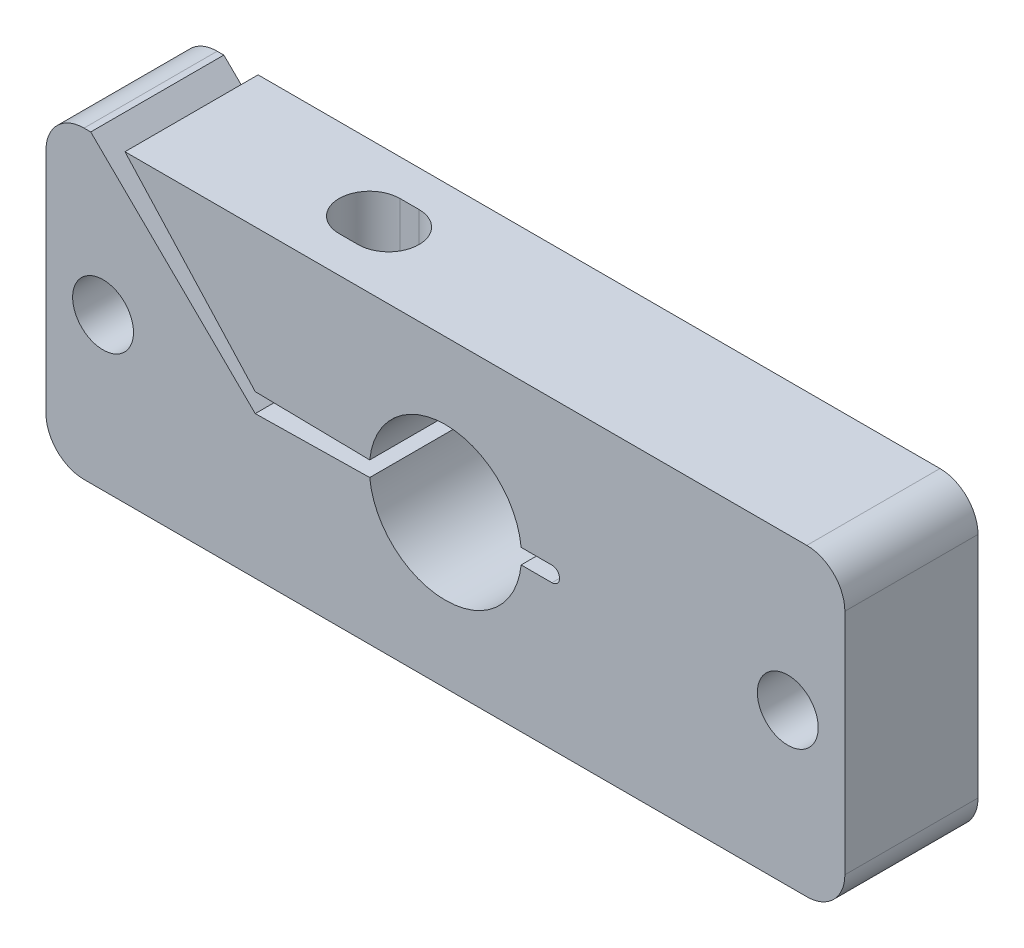
ISO-10303-21;
HEADER;
FILE_DESCRIPTION(('STEP AP214'),'2;1');
FILE_NAME('part.step','',(''),(''),'','','');
FILE_SCHEMA(('AUTOMOTIVE_DESIGN { 1 0 10303 214 1 1 1 1 }'));
ENDSEC;
DATA;
#1=APPLICATION_CONTEXT('core data for automotive mechanical design processes');
#2=APPLICATION_PROTOCOL_DEFINITION('international standard','automotive_design',2000,#1);
#3=PRODUCT_CONTEXT('',#1,'mechanical');
#4=PRODUCT('Part','Part','',(#3));
#5=PRODUCT_RELATED_PRODUCT_CATEGORY('part','',(#4));
#6=PRODUCT_DEFINITION_FORMATION('','',#4);
#7=PRODUCT_DEFINITION_CONTEXT('part definition',#1,'design');
#8=PRODUCT_DEFINITION('design','',#6,#7);
#9=PRODUCT_DEFINITION_SHAPE('','',#8);
#10=(LENGTH_UNIT() NAMED_UNIT(*) SI_UNIT(.MILLI.,.METRE.));
#11=(NAMED_UNIT(*) PLANE_ANGLE_UNIT() SI_UNIT($,.RADIAN.));
#12=(NAMED_UNIT(*) SI_UNIT($,.STERADIAN.) SOLID_ANGLE_UNIT());
#13=UNCERTAINTY_MEASURE_WITH_UNIT(LENGTH_MEASURE(1.E-05),#10,'distance_accuracy_value','');
#14=(GEOMETRIC_REPRESENTATION_CONTEXT(3) GLOBAL_UNCERTAINTY_ASSIGNED_CONTEXT((#13)) GLOBAL_UNIT_ASSIGNED_CONTEXT((#10,
#11,#12)) REPRESENTATION_CONTEXT('',''));
#15=CARTESIAN_POINT('',(0.,0.,0.));
#16=DIRECTION('',(0.,0.,1.));
#17=DIRECTION('',(1.,0.,0.));
#18=AXIS2_PLACEMENT_3D('',#15,#16,#17);
#19=CARTESIAN_POINT('',(5.6,0.,-3.5));
#20=DIRECTION('',(0.,0.,1.));
#21=DIRECTION('',(1.,0.,0.));
#22=AXIS2_PLACEMENT_3D('',#19,#20,#21);
#23=CYLINDRICAL_SURFACE('',#22,0.4);
#24=DIRECTION('',(0.,0.,-1.));
#25=VECTOR('',#24,1.);
#26=CARTESIAN_POINT('',(5.6,0.4,-3.5));
#27=LINE('',#26,#25);
#28=CARTESIAN_POINT('',(5.6,0.4,-3.5));
#29=VERTEX_POINT('',#28);
#30=CARTESIAN_POINT('',(5.6,0.4,3.5));
#31=VERTEX_POINT('',#30);
#32=EDGE_CURVE('E388',#29,#31,#27,.F.);
#33=ORIENTED_EDGE('',*,*,#32,.F.);
#34=CARTESIAN_POINT('',(5.6,0.,-3.5));
#35=DIRECTION('',(0.,0.,1.));
#36=DIRECTION('',(1.,0.,0.));
#37=AXIS2_PLACEMENT_3D('',#34,#35,#36);
#38=CIRCLE('',#37,0.4);
#39=CARTESIAN_POINT('',(5.6,-0.4,-3.5));
#40=VERTEX_POINT('',#39);
#41=EDGE_CURVE('E54',#29,#40,#38,.F.);
#42=ORIENTED_EDGE('',*,*,#41,.T.);
#43=DIRECTION('',(0.,0.,-1.));
#44=VECTOR('',#43,1.);
#45=CARTESIAN_POINT('',(5.6,-0.4,-3.5));
#46=LINE('',#45,#44);
#47=CARTESIAN_POINT('',(5.6,-0.4,3.5));
#48=VERTEX_POINT('',#47);
#49=EDGE_CURVE('E389',#48,#40,#46,.T.);
#50=ORIENTED_EDGE('',*,*,#49,.F.);
#51=CARTESIAN_POINT('',(5.6,0.,3.5));
#52=DIRECTION('',(0.,0.,1.));
#53=DIRECTION('',(1.,0.,0.));
#54=AXIS2_PLACEMENT_3D('',#51,#52,#53);
#55=CIRCLE('',#54,0.4);
#56=EDGE_CURVE('E11',#48,#31,#55,.T.);
#57=ORIENTED_EDGE('',*,*,#56,.T.);
#58=EDGE_LOOP('',(#33,#42,#50,#57));
#59=FACE_BOUND('',#58,.T.);
#60=ADVANCED_FACE('F50',(#59),#23,.F.);
#61=CARTESIAN_POINT('',(-6.98997487421324,8.001,0.));
#62=DIRECTION('',(0.,-1.,0.));
#63=DIRECTION('',(0.,0.,-1.));
#64=AXIS2_PLACEMENT_3D('',#61,#62,#63);
#65=CYLINDRICAL_SURFACE('',#64,1.6);
#66=CARTESIAN_POINT('',(-6.98997487421324,-0.450000000000001,0.));
#67=DIRECTION('',(-0.0166088657318921,0.99986206327628,0.));
#68=DIRECTION('',(-0.99986206327628,-0.0166088657318921,0.));
#69=AXIS2_PLACEMENT_3D('',#66,#67,#68);
#70=ELLIPSE('',#69,1.60022072920462,1.6);
#71=CARTESIAN_POINT('',(-8.58997487421324,-0.476577851232751,0.));
#72=VERTEX_POINT('',#71);
#73=EDGE_CURVE('E245',#72,#72,#70,.F.);
#74=ORIENTED_EDGE('',*,*,#73,.F.);
#75=EDGE_LOOP('',(#74));
#76=FACE_BOUND('',#75,.T.);
#77=CARTESIAN_POINT('',(-6.98997487421324,-1.99999999999999,0.));
#78=DIRECTION('',(0.,-1.,0.));
#79=DIRECTION('',(0.,0.,-1.));
#80=AXIS2_PLACEMENT_3D('',#77,#78,#79);
#81=CIRCLE('',#80,1.6);
#82=CARTESIAN_POINT('',(-6.98997487421324,-1.99999999999999,-1.6));
#83=VERTEX_POINT('',#82);
#84=EDGE_CURVE('E214',#83,#83,#81,.T.);
#85=ORIENTED_EDGE('',*,*,#84,.T.);
#86=EDGE_LOOP('',(#85));
#87=FACE_BOUND('',#86,.T.);
#88=ADVANCED_FACE('F470',(#76,#87),#65,.F.);
#89=CARTESIAN_POINT('',(0.,0.,-3.5));
#90=DIRECTION('',(0.,0.,1.));
#91=DIRECTION('',(1.,0.,0.));
#92=AXIS2_PLACEMENT_3D('',#89,#90,#91);
#93=CYLINDRICAL_SURFACE('',#92,4.);
#94=DIRECTION('',(0.,0.,1.));
#95=VECTOR('',#94,1.);
#96=CARTESIAN_POINT('',(3.97994974842648,0.4,-3.5));
#97=LINE('',#96,#95);
#98=CARTESIAN_POINT('',(3.97994974842648,0.4,-3.5));
#99=VERTEX_POINT('',#98);
#100=CARTESIAN_POINT('',(3.97994974842648,0.4,3.5));
#101=VERTEX_POINT('',#100);
#102=EDGE_CURVE('E334',#99,#101,#97,.T.);
#103=ORIENTED_EDGE('',*,*,#102,.T.);
#104=CARTESIAN_POINT('',(0.,0.,3.5));
#105=DIRECTION('',(0.,0.,-1.));
#106=DIRECTION('',(1.,0.,0.));
#107=AXIS2_PLACEMENT_3D('',#104,#105,#106);
#108=CIRCLE('',#107,4.);
#109=CARTESIAN_POINT('',(-3.97994974842648,0.4,3.5));
#110=VERTEX_POINT('',#109);
#111=EDGE_CURVE('E254',#110,#101,#108,.T.);
#112=ORIENTED_EDGE('',*,*,#111,.F.);
#113=DIRECTION('',(0.,0.,1.));
#114=VECTOR('',#113,1.);
#115=CARTESIAN_POINT('',(-3.97994974842648,0.4,-3.5));
#116=LINE('',#115,#114);
#117=CARTESIAN_POINT('',(-3.97994974842648,0.4,-3.5));
#118=VERTEX_POINT('',#117);
#119=EDGE_CURVE('E335',#118,#110,#116,.T.);
#120=ORIENTED_EDGE('',*,*,#119,.F.);
#121=CARTESIAN_POINT('',(0.,0.,-3.5));
#122=DIRECTION('',(0.,0.,-1.));
#123=DIRECTION('',(1.,0.,0.));
#124=AXIS2_PLACEMENT_3D('',#121,#122,#123);
#125=CIRCLE('',#124,4.);
#126=EDGE_CURVE('E294',#118,#99,#125,.T.);
#127=ORIENTED_EDGE('',*,*,#126,.T.);
#128=EDGE_LOOP('',(#103,#112,#120,#127));
#129=FACE_BOUND('',#128,.T.);
#130=ADVANCED_FACE('F464',(#129),#93,.F.);
#131=CARTESIAN_POINT('',(-10.,0.5,-3.5));
#132=DIRECTION('',(-0.0166088657318921,-0.99986206327628,0.));
#133=DIRECTION('',(0.99986206327628,-0.0166088657318921,0.));
#134=AXIS2_PLACEMENT_3D('',#131,#132,#133);
#135=PLANE('',#134);
#136=CARTESIAN_POINT('',(-7.48997487421324,0.458305578510235,0.));
#137=DIRECTION('',(-0.0166088657318921,-0.99986206327628,0.));
#138=DIRECTION('',(-0.99986206327628,0.0166088657318921,0.));
#139=AXIS2_PLACEMENT_3D('',#136,#137,#138);
#140=ELLIPSE('',#139,1.60022072920462,1.6);
#141=CARTESIAN_POINT('',(-7.48997487421324,0.458305578510235,-1.6));
#142=VERTEX_POINT('',#141);
#143=CARTESIAN_POINT('',(-7.48997487421324,0.458305578510235,1.6));
#144=VERTEX_POINT('',#143);
#145=EDGE_CURVE('E197',#142,#144,#140,.F.);
#146=ORIENTED_EDGE('',*,*,#145,.T.);
#147=DIRECTION('',(0.99986206327628,-0.0166088657318921,0.));
#148=VECTOR('',#147,1.);
#149=CARTESIAN_POINT('',(-7.34949478371137,0.455972041668659,1.6));
#150=LINE('',#149,#148);
#151=CARTESIAN_POINT('',(-6.48997487421324,0.441694421489766,1.6));
#152=VERTEX_POINT('',#151);
#153=EDGE_CURVE('E223',#144,#152,#150,.T.);
#154=ORIENTED_EDGE('',*,*,#153,.T.);
#155=CARTESIAN_POINT('',(-6.48997487421324,0.441694421489766,0.));
#156=DIRECTION('',(-0.0166088657318921,-0.99986206327628,0.));
#157=DIRECTION('',(-0.99986206327628,0.0166088657318921,0.));
#158=AXIS2_PLACEMENT_3D('',#155,#156,#157);
#159=ELLIPSE('',#158,1.60022072920462,1.6);
#160=CARTESIAN_POINT('',(-6.48997487421324,0.441694421489766,-1.6));
#161=VERTEX_POINT('',#160);
#162=EDGE_CURVE('E205',#152,#161,#159,.F.);
#163=ORIENTED_EDGE('',*,*,#162,.T.);
#164=DIRECTION('',(-0.99986206327628,0.0166088657318921,0.));
#165=VECTOR('',#164,1.);
#166=CARTESIAN_POINT('',(-7.34949478371137,0.455972041668659,-1.6));
#167=LINE('',#166,#165);
#168=EDGE_CURVE('E201',#161,#142,#167,.T.);
#169=ORIENTED_EDGE('',*,*,#168,.T.);
#170=EDGE_LOOP('',(#146,#154,#163,#169));
#171=FACE_BOUND('',#170,.T.);
#172=ORIENTED_EDGE('',*,*,#119,.T.);
#173=DIRECTION('',(0.99986206327628,-0.0166088657318921,0.));
#174=VECTOR('',#173,1.);
#175=CARTESIAN_POINT('',(-10.,0.5,3.5));
#176=LINE('',#175,#174);
#177=CARTESIAN_POINT('',(-10.,0.5,3.5));
#178=VERTEX_POINT('',#177);
#179=EDGE_CURVE('E287',#178,#110,#176,.T.);
#180=ORIENTED_EDGE('',*,*,#179,.F.);
#181=DIRECTION('',(0.,0.,1.));
#182=VECTOR('',#181,1.);
#183=CARTESIAN_POINT('',(-10.,0.5,-3.5));
#184=LINE('',#183,#182);
#185=CARTESIAN_POINT('',(-10.,0.5,-3.5));
#186=VERTEX_POINT('',#185);
#187=EDGE_CURVE('E337',#186,#178,#184,.T.);
#188=ORIENTED_EDGE('',*,*,#187,.F.);
#189=DIRECTION('',(0.99986206327628,-0.0166088657318921,0.));
#190=VECTOR('',#189,1.);
#191=CARTESIAN_POINT('',(-10.,0.5,-3.5));
#192=LINE('',#191,#190);
#193=EDGE_CURVE('E328',#186,#118,#192,.T.);
#194=ORIENTED_EDGE('',*,*,#193,.T.);
#195=EDGE_LOOP('',(#172,#180,#188,#194));
#196=FACE_BOUND('',#195,.T.);
#197=ADVANCED_FACE('F460',(#171,#196),#135,.T.);
#198=CARTESIAN_POINT('',(-10.,0.5,-3.5));
#199=DIRECTION('',(-0.73845534062588,-0.674302387583728,0.));
#200=DIRECTION('',(0.674302387583728,-0.73845534062588,0.));
#201=AXIS2_PLACEMENT_3D('',#198,#199,#200);
#202=PLANE('',#201);
#203=ORIENTED_EDGE('',*,*,#187,.T.);
#204=DIRECTION('',(0.674302387583728,-0.73845534062588,0.));
#205=VECTOR('',#204,1.);
#206=CARTESIAN_POINT('',(-10.,0.5,3.5));
#207=LINE('',#206,#205);
#208=CARTESIAN_POINT('',(-16.8484411021954,8.,3.5));
#209=VERTEX_POINT('',#208);
#210=EDGE_CURVE('E285',#209,#178,#207,.T.);
#211=ORIENTED_EDGE('',*,*,#210,.F.);
#212=DIRECTION('',(0.,0.,1.));
#213=VECTOR('',#212,1.);
#214=CARTESIAN_POINT('',(-16.8484411021954,8.,-3.5));
#215=LINE('',#214,#213);
#216=CARTESIAN_POINT('',(-16.8484411021954,8.,-3.5));
#217=VERTEX_POINT('',#216);
#218=EDGE_CURVE('E336',#217,#209,#215,.T.);
#219=ORIENTED_EDGE('',*,*,#218,.F.);
#220=DIRECTION('',(0.674302387583728,-0.73845534062588,0.));
#221=VECTOR('',#220,1.);
#222=CARTESIAN_POINT('',(-10.,0.5,-3.5));
#223=LINE('',#222,#221);
#224=EDGE_CURVE('E329',#217,#186,#223,.T.);
#225=ORIENTED_EDGE('',*,*,#224,.T.);
#226=EDGE_LOOP('',(#203,#211,#219,#225));
#227=FACE_BOUND('',#226,.T.);
#228=ADVANCED_FACE('F454',(#227),#202,.T.);
#229=CARTESIAN_POINT('',(-16.8484411021954,8.,-3.5));
#230=DIRECTION('',(0.,1.,0.));
#231=DIRECTION('',(-1.,0.,0.));
#232=AXIS2_PLACEMENT_3D('',#229,#230,#231);
#233=PLANE('',#232);
#234=CARTESIAN_POINT('',(-7.48997487421324,8.,0.));
#235=DIRECTION('',(0.,1.,0.));
#236=DIRECTION('',(0.,0.,1.));
#237=AXIS2_PLACEMENT_3D('',#234,#235,#236);
#238=CIRCLE('',#237,1.6);
#239=CARTESIAN_POINT('',(-7.48997487421324,8.,-1.6));
#240=VERTEX_POINT('',#239);
#241=CARTESIAN_POINT('',(-7.48997487421324,8.,1.6));
#242=VERTEX_POINT('',#241);
#243=EDGE_CURVE('E196',#240,#242,#238,.T.);
#244=ORIENTED_EDGE('',*,*,#243,.F.);
#245=DIRECTION('',(-1.,0.,0.));
#246=VECTOR('',#245,1.);
#247=CARTESIAN_POINT('',(-7.48997487421324,8.,-1.6));
#248=LINE('',#247,#246);
#249=CARTESIAN_POINT('',(-6.48997487421324,8.,-1.6));
#250=VERTEX_POINT('',#249);
#251=EDGE_CURVE('E210',#250,#240,#248,.T.);
#252=ORIENTED_EDGE('',*,*,#251,.F.);
#253=CARTESIAN_POINT('',(-6.48997487421324,8.,0.));
#254=DIRECTION('',(0.,1.,0.));
#255=DIRECTION('',(0.,0.,1.));
#256=AXIS2_PLACEMENT_3D('',#253,#254,#255);
#257=CIRCLE('',#256,1.6);
#258=CARTESIAN_POINT('',(-6.48997487421324,8.,1.6));
#259=VERTEX_POINT('',#258);
#260=EDGE_CURVE('E212',#259,#250,#257,.T.);
#261=ORIENTED_EDGE('',*,*,#260,.F.);
#262=DIRECTION('',(1.,0.,0.));
#263=VECTOR('',#262,1.);
#264=CARTESIAN_POINT('',(-7.48997487421324,8.,1.6));
#265=LINE('',#264,#263);
#266=EDGE_CURVE('E222',#242,#259,#265,.T.);
#267=ORIENTED_EDGE('',*,*,#266,.F.);
#268=EDGE_LOOP('',(#244,#252,#261,#267));
#269=FACE_BOUND('',#268,.T.);
#270=DIRECTION('',(-1.,0.,0.));
#271=VECTOR('',#270,1.);
#272=CARTESIAN_POINT('',(-16.8484411021954,8.,3.5));
#273=LINE('',#272,#271);
#274=CARTESIAN_POINT('',(19.,8.00000000000001,3.5));
#275=VERTEX_POINT('',#274);
#276=EDGE_CURVE('E284',#275,#209,#273,.T.);
#277=ORIENTED_EDGE('',*,*,#276,.F.);
#278=DIRECTION('',(0.,0.,1.));
#279=VECTOR('',#278,1.);
#280=CARTESIAN_POINT('',(19.,8.00000000000001,-3.5));
#281=LINE('',#280,#279);
#282=CARTESIAN_POINT('',(19.,8.00000000000001,-3.5));
#283=VERTEX_POINT('',#282);
#284=EDGE_CURVE('E382',#275,#283,#281,.F.);
#285=ORIENTED_EDGE('',*,*,#284,.T.);
#286=DIRECTION('',(-1.,0.,0.));
#287=VECTOR('',#286,1.);
#288=CARTESIAN_POINT('',(-16.8484411021954,8.,-3.5));
#289=LINE('',#288,#287);
#290=EDGE_CURVE('E324',#283,#217,#289,.T.);
#291=ORIENTED_EDGE('',*,*,#290,.T.);
#292=ORIENTED_EDGE('',*,*,#218,.T.);
#293=EDGE_LOOP('',(#277,#285,#291,#292));
#294=FACE_BOUND('',#293,.T.);
#295=ADVANCED_FACE('F220',(#269,#294),#233,.T.);
#296=CARTESIAN_POINT('',(21.,8.00000000000001,-3.5));
#297=DIRECTION('',(1.,0.,0.));
#298=DIRECTION('',(0.,1.,0.));
#299=AXIS2_PLACEMENT_3D('',#296,#297,#298);
#300=PLANE('',#299);
#301=DIRECTION('',(0.,1.,0.));
#302=VECTOR('',#301,1.);
#303=CARTESIAN_POINT('',(21.,8.00000000000001,3.5));
#304=LINE('',#303,#302);
#305=CARTESIAN_POINT('',(21.,-5.99999999999998,3.5));
#306=VERTEX_POINT('',#305);
#307=CARTESIAN_POINT('',(21.,6.00000000000001,3.5));
#308=VERTEX_POINT('',#307);
#309=EDGE_CURVE('E276',#306,#308,#304,.T.);
#310=ORIENTED_EDGE('',*,*,#309,.F.);
#311=DIRECTION('',(0.,0.,1.));
#312=VECTOR('',#311,1.);
#313=CARTESIAN_POINT('',(21.,-5.99999999999998,-3.5));
#314=LINE('',#313,#312);
#315=CARTESIAN_POINT('',(21.,-5.99999999999998,-3.5));
#316=VERTEX_POINT('',#315);
#317=EDGE_CURVE('E378',#306,#316,#314,.F.);
#318=ORIENTED_EDGE('',*,*,#317,.T.);
#319=DIRECTION('',(0.,1.,0.));
#320=VECTOR('',#319,1.);
#321=CARTESIAN_POINT('',(21.,8.00000000000001,-3.5));
#322=LINE('',#321,#320);
#323=CARTESIAN_POINT('',(21.,6.00000000000001,-3.5));
#324=VERTEX_POINT('',#323);
#325=EDGE_CURVE('E323',#316,#324,#322,.T.);
#326=ORIENTED_EDGE('',*,*,#325,.T.);
#327=DIRECTION('',(0.,0.,1.));
#328=VECTOR('',#327,1.);
#329=CARTESIAN_POINT('',(21.,6.00000000000001,-3.5));
#330=LINE('',#329,#328);
#331=EDGE_CURVE('E376',#324,#308,#330,.T.);
#332=ORIENTED_EDGE('',*,*,#331,.T.);
#333=EDGE_LOOP('',(#310,#318,#326,#332));
#334=FACE_BOUND('',#333,.T.);
#335=ADVANCED_FACE('F441',(#334),#300,.T.);
#336=CARTESIAN_POINT('',(-21.,-7.99999999999999,-3.5));
#337=DIRECTION('',(0.,-1.,0.));
#338=DIRECTION('',(1.,0.,0.));
#339=AXIS2_PLACEMENT_3D('',#336,#337,#338);
#340=PLANE('',#339);
#341=CARTESIAN_POINT('',(-6.98997487421324,-7.99999999999999,0.));
#342=DIRECTION('',(0.,-1.,0.));
#343=DIRECTION('',(0.,0.,-1.));
#344=AXIS2_PLACEMENT_3D('',#341,#342,#343);
#345=CIRCLE('',#344,2.2);
#346=CARTESIAN_POINT('',(-6.98997487421324,-7.99999999999999,-2.2));
#347=VERTEX_POINT('',#346);
#348=EDGE_CURVE('E238',#347,#347,#345,.T.);
#349=ORIENTED_EDGE('',*,*,#348,.F.);
#350=EDGE_LOOP('',(#349));
#351=FACE_BOUND('',#350,.T.);
#352=DIRECTION('',(1.,0.,0.));
#353=VECTOR('',#352,1.);
#354=CARTESIAN_POINT('',(-21.,-7.99999999999999,3.5));
#355=LINE('',#354,#353);
#356=CARTESIAN_POINT('',(-19.,-7.99999999999999,3.5));
#357=VERTEX_POINT('',#356);
#358=CARTESIAN_POINT('',(19.,-7.99999999999999,3.5));
#359=VERTEX_POINT('',#358);
#360=EDGE_CURVE('E273',#357,#359,#355,.T.);
#361=ORIENTED_EDGE('',*,*,#360,.F.);
#362=DIRECTION('',(0.,0.,1.));
#363=VECTOR('',#362,1.);
#364=CARTESIAN_POINT('',(-19.,-7.99999999999999,-3.5));
#365=LINE('',#364,#363);
#366=CARTESIAN_POINT('',(-19.,-7.99999999999999,-3.5));
#367=VERTEX_POINT('',#366);
#368=EDGE_CURVE('E366',#357,#367,#365,.F.);
#369=ORIENTED_EDGE('',*,*,#368,.T.);
#370=DIRECTION('',(1.,0.,0.));
#371=VECTOR('',#370,1.);
#372=CARTESIAN_POINT('',(-21.,-7.99999999999999,-3.5));
#373=LINE('',#372,#371);
#374=CARTESIAN_POINT('',(19.,-7.99999999999999,-3.5));
#375=VERTEX_POINT('',#374);
#376=EDGE_CURVE('E319',#367,#375,#373,.T.);
#377=ORIENTED_EDGE('',*,*,#376,.T.);
#378=DIRECTION('',(0.,0.,1.));
#379=VECTOR('',#378,1.);
#380=CARTESIAN_POINT('',(19.,-7.99999999999999,-3.5));
#381=LINE('',#380,#379);
#382=EDGE_CURVE('E361',#375,#359,#381,.T.);
#383=ORIENTED_EDGE('',*,*,#382,.T.);
#384=EDGE_LOOP('',(#361,#369,#377,#383));
#385=FACE_BOUND('',#384,.T.);
#386=ADVANCED_FACE('F433',(#351,#385),#340,.T.);
#387=CARTESIAN_POINT('',(-21.,8.,-3.5));
#388=DIRECTION('',(-1.,0.,0.));
#389=DIRECTION('',(0.,-1.,0.));
#390=AXIS2_PLACEMENT_3D('',#387,#388,#389);
#391=PLANE('',#390);
#392=DIRECTION('',(0.,-1.,0.));
#393=VECTOR('',#392,1.);
#394=CARTESIAN_POINT('',(-21.,8.,-3.5));
#395=LINE('',#394,#393);
#396=CARTESIAN_POINT('',(-21.,6.,-3.5));
#397=VERTEX_POINT('',#396);
#398=CARTESIAN_POINT('',(-21.,-5.99999999999999,-3.5));
#399=VERTEX_POINT('',#398);
#400=EDGE_CURVE('E314',#397,#399,#395,.T.);
#401=ORIENTED_EDGE('',*,*,#400,.T.);
#402=DIRECTION('',(0.,0.,1.));
#403=VECTOR('',#402,1.);
#404=CARTESIAN_POINT('',(-21.,-5.99999999999999,-3.5));
#405=LINE('',#404,#403);
#406=CARTESIAN_POINT('',(-21.,-5.99999999999999,3.5));
#407=VERTEX_POINT('',#406);
#408=EDGE_CURVE('E354',#399,#407,#405,.T.);
#409=ORIENTED_EDGE('',*,*,#408,.T.);
#410=DIRECTION('',(0.,-1.,0.));
#411=VECTOR('',#410,1.);
#412=CARTESIAN_POINT('',(-21.,8.,3.5));
#413=LINE('',#412,#411);
#414=CARTESIAN_POINT('',(-21.,6.,3.5));
#415=VERTEX_POINT('',#414);
#416=EDGE_CURVE('E275',#415,#407,#413,.T.);
#417=ORIENTED_EDGE('',*,*,#416,.F.);
#418=DIRECTION('',(0.,0.,1.));
#419=VECTOR('',#418,1.);
#420=CARTESIAN_POINT('',(-21.,6.,-3.5));
#421=LINE('',#420,#419);
#422=EDGE_CURVE('E333',#415,#397,#421,.F.);
#423=ORIENTED_EDGE('',*,*,#422,.T.);
#424=EDGE_LOOP('',(#401,#409,#417,#423));
#425=FACE_BOUND('',#424,.T.);
#426=ADVANCED_FACE('F424',(#425),#391,.T.);
#427=CARTESIAN_POINT('',(-21.,8.,-3.5));
#428=DIRECTION('',(0.,1.,0.));
#429=DIRECTION('',(-1.,0.,0.));
#430=AXIS2_PLACEMENT_3D('',#427,#428,#429);
#431=PLANE('',#430);
#432=DIRECTION('',(-1.,0.,0.));
#433=VECTOR('',#432,1.);
#434=CARTESIAN_POINT('',(-21.,8.,-3.5));
#435=LINE('',#434,#433);
#436=CARTESIAN_POINT('',(-18.6496628402632,8.,-3.5));
#437=VERTEX_POINT('',#436);
#438=CARTESIAN_POINT('',(-19.,8.,-3.5));
#439=VERTEX_POINT('',#438);
#440=EDGE_CURVE('E315',#437,#439,#435,.T.);
#441=ORIENTED_EDGE('',*,*,#440,.T.);
#442=DIRECTION('',(0.,0.,1.));
#443=VECTOR('',#442,1.);
#444=CARTESIAN_POINT('',(-19.,8.,-3.5));
#445=LINE('',#444,#443);
#446=CARTESIAN_POINT('',(-19.,8.,3.5));
#447=VERTEX_POINT('',#446);
#448=EDGE_CURVE('E384',#439,#447,#445,.T.);
#449=ORIENTED_EDGE('',*,*,#448,.T.);
#450=DIRECTION('',(-1.,0.,0.));
#451=VECTOR('',#450,1.);
#452=CARTESIAN_POINT('',(-21.,8.,3.5));
#453=LINE('',#452,#451);
#454=CARTESIAN_POINT('',(-18.6496628402632,8.,3.5));
#455=VERTEX_POINT('',#454);
#456=EDGE_CURVE('E266',#455,#447,#453,.T.);
#457=ORIENTED_EDGE('',*,*,#456,.F.);
#458=DIRECTION('',(0.,0.,1.));
#459=VECTOR('',#458,1.);
#460=CARTESIAN_POINT('',(-18.6496628402632,8.,-3.5));
#461=LINE('',#460,#459);
#462=EDGE_CURVE('E343',#437,#455,#461,.T.);
#463=ORIENTED_EDGE('',*,*,#462,.F.);
#464=EDGE_LOOP('',(#441,#449,#457,#463));
#465=FACE_BOUND('',#464,.T.);
#466=ADVANCED_FACE('F420',(#465),#431,.T.);
#467=CARTESIAN_POINT('',(-10.,-0.5,-3.5));
#468=DIRECTION('',(0.700909264299847,0.713250449154186,0.));
#469=DIRECTION('',(-0.713250449154186,0.700909264299847,0.));
#470=AXIS2_PLACEMENT_3D('',#467,#468,#469);
#471=PLANE('',#470);
#472=ORIENTED_EDGE('',*,*,#462,.T.);
#473=DIRECTION('',(-0.713250449154186,0.700909264299847,0.));
#474=VECTOR('',#473,1.);
#475=CARTESIAN_POINT('',(-10.,-0.5,3.5));
#476=LINE('',#475,#474);
#477=CARTESIAN_POINT('',(-10.,-0.5,3.5));
#478=VERTEX_POINT('',#477);
#479=EDGE_CURVE('E267',#478,#455,#476,.T.);
#480=ORIENTED_EDGE('',*,*,#479,.F.);
#481=DIRECTION('',(0.,0.,1.));
#482=VECTOR('',#481,1.);
#483=CARTESIAN_POINT('',(-10.,-0.5,-3.5));
#484=LINE('',#483,#482);
#485=CARTESIAN_POINT('',(-10.,-0.5,-3.5));
#486=VERTEX_POINT('',#485);
#487=EDGE_CURVE('E341',#486,#478,#484,.T.);
#488=ORIENTED_EDGE('',*,*,#487,.F.);
#489=DIRECTION('',(-0.713250449154186,0.700909264299847,0.));
#490=VECTOR('',#489,1.);
#491=CARTESIAN_POINT('',(-10.,-0.5,-3.5));
#492=LINE('',#491,#490);
#493=EDGE_CURVE('E307',#486,#437,#492,.T.);
#494=ORIENTED_EDGE('',*,*,#493,.T.);
#495=EDGE_LOOP('',(#472,#480,#488,#494));
#496=FACE_BOUND('',#495,.T.);
#497=ADVANCED_FACE('F411',(#496),#471,.T.);
#498=CARTESIAN_POINT('',(-10.,-0.5,-3.5));
#499=DIRECTION('',(-0.0166088657318921,0.99986206327628,0.));
#500=DIRECTION('',(-0.99986206327628,-0.0166088657318921,0.));
#501=AXIS2_PLACEMENT_3D('',#498,#499,#500);
#502=PLANE('',#501);
#503=ORIENTED_EDGE('',*,*,#73,.T.);
#504=EDGE_LOOP('',(#503));
#505=FACE_BOUND('',#504,.T.);
#506=ORIENTED_EDGE('',*,*,#487,.T.);
#507=DIRECTION('',(-0.99986206327628,-0.0166088657318921,0.));
#508=VECTOR('',#507,1.);
#509=CARTESIAN_POINT('',(-10.,-0.5,3.5));
#510=LINE('',#509,#508);
#511=CARTESIAN_POINT('',(-3.97994974842648,-0.399999999999999,3.5));
#512=VERTEX_POINT('',#511);
#513=EDGE_CURVE('E265',#512,#478,#510,.T.);
#514=ORIENTED_EDGE('',*,*,#513,.F.);
#515=DIRECTION('',(0.,0.,1.));
#516=VECTOR('',#515,1.);
#517=CARTESIAN_POINT('',(-3.97994974842648,-0.399999999999999,-3.5));
#518=LINE('',#517,#516);
#519=CARTESIAN_POINT('',(-3.97994974842648,-0.399999999999999,-3.5));
#520=VERTEX_POINT('',#519);
#521=EDGE_CURVE('E342',#520,#512,#518,.T.);
#522=ORIENTED_EDGE('',*,*,#521,.F.);
#523=DIRECTION('',(-0.99986206327628,-0.0166088657318921,0.));
#524=VECTOR('',#523,1.);
#525=CARTESIAN_POINT('',(-10.,-0.5,-3.5));
#526=LINE('',#525,#524);
#527=EDGE_CURVE('E306',#520,#486,#526,.T.);
#528=ORIENTED_EDGE('',*,*,#527,.T.);
#529=EDGE_LOOP('',(#506,#514,#522,#528));
#530=FACE_BOUND('',#529,.T.);
#531=ADVANCED_FACE('F407',(#505,#530),#502,.T.);
#532=CARTESIAN_POINT('',(0.,0.,-3.5));
#533=DIRECTION('',(0.,0.,1.));
#534=DIRECTION('',(1.,0.,0.));
#535=AXIS2_PLACEMENT_3D('',#532,#533,#534);
#536=CYLINDRICAL_SURFACE('',#535,4.);
#537=ORIENTED_EDGE('',*,*,#521,.T.);
#538=CARTESIAN_POINT('',(0.,0.,3.5));
#539=DIRECTION('',(0.,0.,-1.));
#540=DIRECTION('',(1.,0.,0.));
#541=AXIS2_PLACEMENT_3D('',#538,#539,#540);
#542=CIRCLE('',#541,4.);
#543=CARTESIAN_POINT('',(3.97994974842648,-0.4,3.5));
#544=VERTEX_POINT('',#543);
#545=EDGE_CURVE('E257',#544,#512,#542,.T.);
#546=ORIENTED_EDGE('',*,*,#545,.F.);
#547=DIRECTION('',(0.,0.,1.));
#548=VECTOR('',#547,1.);
#549=CARTESIAN_POINT('',(3.97994974842648,-0.4,-3.5));
#550=LINE('',#549,#548);
#551=CARTESIAN_POINT('',(3.97994974842648,-0.4,-3.5));
#552=VERTEX_POINT('',#551);
#553=EDGE_CURVE('E346',#552,#544,#550,.T.);
#554=ORIENTED_EDGE('',*,*,#553,.F.);
#555=CARTESIAN_POINT('',(0.,0.,-3.5));
#556=DIRECTION('',(0.,0.,-1.));
#557=DIRECTION('',(1.,0.,0.));
#558=AXIS2_PLACEMENT_3D('',#555,#556,#557);
#559=CIRCLE('',#558,4.);
#560=EDGE_CURVE('E303',#552,#520,#559,.T.);
#561=ORIENTED_EDGE('',*,*,#560,.T.);
#562=EDGE_LOOP('',(#537,#546,#554,#561));
#563=FACE_BOUND('',#562,.T.);
#564=ADVANCED_FACE('F401',(#563),#536,.F.);
#565=CARTESIAN_POINT('',(3.97994974842648,-0.4,-3.5));
#566=DIRECTION('',(0.,1.,0.));
#567=DIRECTION('',(0.,0.,1.));
#568=AXIS2_PLACEMENT_3D('',#565,#566,#567);
#569=PLANE('',#568);
#570=DIRECTION('',(-1.,0.,0.));
#571=VECTOR('',#570,1.);
#572=CARTESIAN_POINT('',(3.97994974842648,-0.4,3.5));
#573=LINE('',#572,#571);
#574=EDGE_CURVE('E256',#48,#544,#573,.T.);
#575=ORIENTED_EDGE('',*,*,#574,.F.);
#576=ORIENTED_EDGE('',*,*,#49,.T.);
#577=DIRECTION('',(-1.,0.,0.));
#578=VECTOR('',#577,1.);
#579=CARTESIAN_POINT('',(3.97994974842648,-0.4,-3.5));
#580=LINE('',#579,#578);
#581=EDGE_CURVE('E301',#40,#552,#580,.T.);
#582=ORIENTED_EDGE('',*,*,#581,.T.);
#583=ORIENTED_EDGE('',*,*,#553,.T.);
#584=EDGE_LOOP('',(#575,#576,#582,#583));
#585=FACE_BOUND('',#584,.T.);
#586=ADVANCED_FACE('F395',(#585),#569,.T.);
#587=CARTESIAN_POINT('',(3.97994974842648,0.4,-3.5));
#588=DIRECTION('',(0.,-1.,0.));
#589=DIRECTION('',(0.,0.,-1.));
#590=AXIS2_PLACEMENT_3D('',#587,#588,#589);
#591=PLANE('',#590);
#592=DIRECTION('',(1.,0.,0.));
#593=VECTOR('',#592,1.);
#594=CARTESIAN_POINT('',(3.97994974842648,0.4,-3.5));
#595=LINE('',#594,#593);
#596=EDGE_CURVE('E296',#99,#29,#595,.T.);
#597=ORIENTED_EDGE('',*,*,#596,.T.);
#598=ORIENTED_EDGE('',*,*,#32,.T.);
#599=DIRECTION('',(1.,0.,0.));
#600=VECTOR('',#599,1.);
#601=CARTESIAN_POINT('',(3.97994974842648,0.4,3.5));
#602=LINE('',#601,#600);
#603=EDGE_CURVE('E258',#101,#31,#602,.T.);
#604=ORIENTED_EDGE('',*,*,#603,.F.);
#605=ORIENTED_EDGE('',*,*,#102,.F.);
#606=EDGE_LOOP('',(#597,#598,#604,#605));
#607=FACE_BOUND('',#606,.T.);
#608=ADVANCED_FACE('F461',(#607),#591,.T.);
#609=CARTESIAN_POINT('',(0.,0.,-3.5));
#610=DIRECTION('',(0.,0.,1.));
#611=DIRECTION('',(1.,0.,0.));
#612=AXIS2_PLACEMENT_3D('',#609,#610,#611);
#613=PLANE('',#612);
#614=CARTESIAN_POINT('',(18.,0.,-3.5));
#615=DIRECTION('',(0.,0.,1.));
#616=DIRECTION('',(-1.,0.,0.));
#617=AXIS2_PLACEMENT_3D('',#614,#615,#616);
#618=CIRCLE('',#617,1.60000000000001);
#619=CARTESIAN_POINT('',(16.4,0.,-3.5));
#620=VERTEX_POINT('',#619);
#621=EDGE_CURVE('E286',#620,#620,#618,.T.);
#622=ORIENTED_EDGE('',*,*,#621,.T.);
#623=EDGE_LOOP('',(#622));
#624=FACE_BOUND('',#623,.T.);
#625=CARTESIAN_POINT('',(-18.,0.,-3.5));
#626=DIRECTION('',(0.,0.,1.));
#627=DIRECTION('',(1.,0.,0.));
#628=AXIS2_PLACEMENT_3D('',#625,#626,#627);
#629=CIRCLE('',#628,1.6);
#630=CARTESIAN_POINT('',(-16.4,0.,-3.5));
#631=VERTEX_POINT('',#630);
#632=EDGE_CURVE('E292',#631,#631,#629,.T.);
#633=ORIENTED_EDGE('',*,*,#632,.T.);
#634=EDGE_LOOP('',(#633));
#635=FACE_BOUND('',#634,.T.);
#636=ORIENTED_EDGE('',*,*,#376,.F.);
#637=CARTESIAN_POINT('',(-19.,-5.99999999999999,-3.5));
#638=DIRECTION('',(0.,0.,1.));
#639=DIRECTION('',(1.,0.,0.));
#640=AXIS2_PLACEMENT_3D('',#637,#638,#639);
#641=CIRCLE('',#640,2.);
#642=EDGE_CURVE('E372',#367,#399,#641,.F.);
#643=ORIENTED_EDGE('',*,*,#642,.T.);
#644=ORIENTED_EDGE('',*,*,#400,.F.);
#645=CARTESIAN_POINT('',(-19.,6.,-3.5));
#646=DIRECTION('',(0.,0.,1.));
#647=DIRECTION('',(1.,0.,0.));
#648=AXIS2_PLACEMENT_3D('',#645,#646,#647);
#649=CIRCLE('',#648,2.);
#650=EDGE_CURVE('E368',#397,#439,#649,.F.);
#651=ORIENTED_EDGE('',*,*,#650,.T.);
#652=ORIENTED_EDGE('',*,*,#440,.F.);
#653=ORIENTED_EDGE('',*,*,#493,.F.);
#654=ORIENTED_EDGE('',*,*,#527,.F.);
#655=ORIENTED_EDGE('',*,*,#560,.F.);
#656=ORIENTED_EDGE('',*,*,#581,.F.);
#657=ORIENTED_EDGE('',*,*,#41,.F.);
#658=ORIENTED_EDGE('',*,*,#596,.F.);
#659=ORIENTED_EDGE('',*,*,#126,.F.);
#660=ORIENTED_EDGE('',*,*,#193,.F.);
#661=ORIENTED_EDGE('',*,*,#224,.F.);
#662=ORIENTED_EDGE('',*,*,#290,.F.);
#663=CARTESIAN_POINT('',(19.,6.00000000000001,-3.5));
#664=DIRECTION('',(0.,0.,1.));
#665=DIRECTION('',(1.,0.,0.));
#666=AXIS2_PLACEMENT_3D('',#663,#664,#665);
#667=CIRCLE('',#666,2.);
#668=EDGE_CURVE('E369',#283,#324,#667,.F.);
#669=ORIENTED_EDGE('',*,*,#668,.T.);
#670=ORIENTED_EDGE('',*,*,#325,.F.);
#671=CARTESIAN_POINT('',(19.,-5.99999999999999,-3.5));
#672=DIRECTION('',(0.,0.,1.));
#673=DIRECTION('',(1.,0.,0.));
#674=AXIS2_PLACEMENT_3D('',#671,#672,#673);
#675=CIRCLE('',#674,2.);
#676=EDGE_CURVE('E375',#316,#375,#675,.F.);
#677=ORIENTED_EDGE('',*,*,#676,.T.);
#678=EDGE_LOOP('',(#636,#643,#644,#651,#652,#653,#654,#655,#656,#657,#658,#659,#660,#661,#662,
#669,#670,#677));
#679=FACE_BOUND('',#678,.T.);
#680=ADVANCED_FACE('F400',(#624,#635,#679),#613,.F.);
#681=CARTESIAN_POINT('',(-18.,0.,-3.5));
#682=DIRECTION('',(0.,0.,1.));
#683=DIRECTION('',(1.,0.,0.));
#684=AXIS2_PLACEMENT_3D('',#681,#682,#683);
#685=CYLINDRICAL_SURFACE('',#684,1.6);
#686=ORIENTED_EDGE('',*,*,#632,.F.);
#687=EDGE_LOOP('',(#686));
#688=FACE_BOUND('',#687,.T.);
#689=CARTESIAN_POINT('',(-18.,0.,3.5));
#690=DIRECTION('',(0.,0.,1.));
#691=DIRECTION('',(1.,0.,0.));
#692=AXIS2_PLACEMENT_3D('',#689,#690,#691);
#693=CIRCLE('',#692,1.6);
#694=CARTESIAN_POINT('',(-16.4,0.,3.5));
#695=VERTEX_POINT('',#694);
#696=EDGE_CURVE('E249',#695,#695,#693,.T.);
#697=ORIENTED_EDGE('',*,*,#696,.T.);
#698=EDGE_LOOP('',(#697));
#699=FACE_BOUND('',#698,.T.);
#700=ADVANCED_FACE('F495',(#688,#699),#685,.F.);
#701=CARTESIAN_POINT('',(18.,0.,-3.5));
#702=DIRECTION('',(0.,0.,1.));
#703=DIRECTION('',(1.,0.,0.));
#704=AXIS2_PLACEMENT_3D('',#701,#702,#703);
#705=CYLINDRICAL_SURFACE('',#704,1.60000000000001);
#706=ORIENTED_EDGE('',*,*,#621,.F.);
#707=EDGE_LOOP('',(#706));
#708=FACE_BOUND('',#707,.T.);
#709=CARTESIAN_POINT('',(18.,0.,3.5));
#710=DIRECTION('',(0.,0.,1.));
#711=DIRECTION('',(-1.,0.,0.));
#712=AXIS2_PLACEMENT_3D('',#709,#710,#711);
#713=CIRCLE('',#712,1.60000000000001);
#714=CARTESIAN_POINT('',(16.4,0.,3.5));
#715=VERTEX_POINT('',#714);
#716=EDGE_CURVE('E250',#715,#715,#713,.T.);
#717=ORIENTED_EDGE('',*,*,#716,.T.);
#718=EDGE_LOOP('',(#717));
#719=FACE_BOUND('',#718,.T.);
#720=ADVANCED_FACE('F490',(#708,#719),#705,.F.);
#721=CARTESIAN_POINT('',(0.,0.,3.5));
#722=DIRECTION('',(0.,0.,1.));
#723=DIRECTION('',(1.,0.,0.));
#724=AXIS2_PLACEMENT_3D('',#721,#722,#723);
#725=PLANE('',#724);
#726=ORIENTED_EDGE('',*,*,#56,.F.);
#727=ORIENTED_EDGE('',*,*,#574,.T.);
#728=ORIENTED_EDGE('',*,*,#545,.T.);
#729=ORIENTED_EDGE('',*,*,#513,.T.);
#730=ORIENTED_EDGE('',*,*,#479,.T.);
#731=ORIENTED_EDGE('',*,*,#456,.T.);
#732=CARTESIAN_POINT('',(-19.,6.,3.5));
#733=DIRECTION('',(0.,0.,1.));
#734=DIRECTION('',(1.,0.,0.));
#735=AXIS2_PLACEMENT_3D('',#732,#733,#734);
#736=CIRCLE('',#735,2.);
#737=EDGE_CURVE('E353',#447,#415,#736,.T.);
#738=ORIENTED_EDGE('',*,*,#737,.T.);
#739=ORIENTED_EDGE('',*,*,#416,.T.);
#740=CARTESIAN_POINT('',(-19.,-5.99999999999999,3.5));
#741=DIRECTION('',(0.,0.,1.));
#742=DIRECTION('',(1.,0.,0.));
#743=AXIS2_PLACEMENT_3D('',#740,#741,#742);
#744=CIRCLE('',#743,2.);
#745=EDGE_CURVE('E363',#407,#357,#744,.T.);
#746=ORIENTED_EDGE('',*,*,#745,.T.);
#747=ORIENTED_EDGE('',*,*,#360,.T.);
#748=CARTESIAN_POINT('',(19.,-5.99999999999999,3.5));
#749=DIRECTION('',(0.,0.,1.));
#750=DIRECTION('',(1.,0.,0.));
#751=AXIS2_PLACEMENT_3D('',#748,#749,#750);
#752=CIRCLE('',#751,2.);
#753=EDGE_CURVE('E360',#359,#306,#752,.T.);
#754=ORIENTED_EDGE('',*,*,#753,.T.);
#755=ORIENTED_EDGE('',*,*,#309,.T.);
#756=CARTESIAN_POINT('',(19.,6.00000000000001,3.5));
#757=DIRECTION('',(0.,0.,1.));
#758=DIRECTION('',(1.,0.,0.));
#759=AXIS2_PLACEMENT_3D('',#756,#757,#758);
#760=CIRCLE('',#759,2.);
#761=EDGE_CURVE('E357',#308,#275,#760,.T.);
#762=ORIENTED_EDGE('',*,*,#761,.T.);
#763=ORIENTED_EDGE('',*,*,#276,.T.);
#764=ORIENTED_EDGE('',*,*,#210,.T.);
#765=ORIENTED_EDGE('',*,*,#179,.T.);
#766=ORIENTED_EDGE('',*,*,#111,.T.);
#767=ORIENTED_EDGE('',*,*,#603,.T.);
#768=EDGE_LOOP('',(#726,#727,#728,#729,#730,#731,#738,#739,#746,#747,#754,#755,#762,#763,#764,
#765,#766,#767));
#769=FACE_BOUND('',#768,.T.);
#770=ORIENTED_EDGE('',*,*,#696,.F.);
#771=EDGE_LOOP('',(#770));
#772=FACE_BOUND('',#771,.T.);
#773=ORIENTED_EDGE('',*,*,#716,.F.);
#774=EDGE_LOOP('',(#773));
#775=FACE_BOUND('',#774,.T.);
#776=ADVANCED_FACE('F408',(#769,#772,#775),#725,.T.);
#777=CARTESIAN_POINT('',(-6.98997487421324,-1.99999999999999,0.));
#778=DIRECTION('',(0.,-1.,0.));
#779=DIRECTION('',(0.,0.,-1.));
#780=AXIS2_PLACEMENT_3D('',#777,#778,#779);
#781=CYLINDRICAL_SURFACE('',#780,2.2);
#782=CARTESIAN_POINT('',(-6.98997487421324,-1.99999999999999,0.));
#783=DIRECTION('',(0.,-1.,0.));
#784=DIRECTION('',(0.,0.,-1.));
#785=AXIS2_PLACEMENT_3D('',#782,#783,#784);
#786=CIRCLE('',#785,2.2);
#787=CARTESIAN_POINT('',(-6.98997487421324,-1.99999999999999,-2.2));
#788=VERTEX_POINT('',#787);
#789=EDGE_CURVE('E237',#788,#788,#786,.T.);
#790=ORIENTED_EDGE('',*,*,#789,.F.);
#791=EDGE_LOOP('',(#790));
#792=FACE_BOUND('',#791,.T.);
#793=ORIENTED_EDGE('',*,*,#348,.T.);
#794=EDGE_LOOP('',(#793));
#795=FACE_BOUND('',#794,.T.);
#796=ADVANCED_FACE('F483',(#792,#795),#781,.F.);
#797=CARTESIAN_POINT('',(-6.98997487421324,-1.99999999999999,0.));
#798=DIRECTION('',(0.,-1.,0.));
#799=DIRECTION('',(0.,0.,-1.));
#800=AXIS2_PLACEMENT_3D('',#797,#798,#799);
#801=PLANE('',#800);
#802=ORIENTED_EDGE('',*,*,#84,.F.);
#803=EDGE_LOOP('',(#802));
#804=FACE_BOUND('',#803,.T.);
#805=ORIENTED_EDGE('',*,*,#789,.T.);
#806=EDGE_LOOP('',(#805));
#807=FACE_BOUND('',#806,.T.);
#808=ADVANCED_FACE('F602',(#804,#807),#801,.T.);
#809=CARTESIAN_POINT('',(-7.48997487421324,-8.00099999999999,0.));
#810=DIRECTION('',(0.,1.,0.));
#811=DIRECTION('',(0.,0.,1.));
#812=AXIS2_PLACEMENT_3D('',#809,#810,#811);
#813=CYLINDRICAL_SURFACE('',#812,1.6);
#814=DIRECTION('',(0.,1.,0.));
#815=VECTOR('',#814,1.);
#816=CARTESIAN_POINT('',(-7.48997487421324,-8.00099999999999,-1.6));
#817=LINE('',#816,#815);
#818=EDGE_CURVE('E195',#142,#240,#817,.T.);
#819=ORIENTED_EDGE('',*,*,#818,.T.);
#820=ORIENTED_EDGE('',*,*,#243,.T.);
#821=DIRECTION('',(0.,1.,0.));
#822=VECTOR('',#821,1.);
#823=CARTESIAN_POINT('',(-7.48997487421324,-8.00099999999999,1.6));
#824=LINE('',#823,#822);
#825=EDGE_CURVE('E229',#144,#242,#824,.T.);
#826=ORIENTED_EDGE('',*,*,#825,.F.);
#827=ORIENTED_EDGE('',*,*,#145,.F.);
#828=EDGE_LOOP('',(#819,#820,#826,#827));
#829=FACE_BOUND('',#828,.T.);
#830=ADVANCED_FACE('F194',(#829),#813,.F.);
#831=CARTESIAN_POINT('',(-7.48997487421324,-8.00099999999999,-1.6));
#832=DIRECTION('',(0.,0.,-1.));
#833=DIRECTION('',(-1.,0.,0.));
#834=AXIS2_PLACEMENT_3D('',#831,#832,#833);
#835=PLANE('',#834);
#836=DIRECTION('',(0.,1.,0.));
#837=VECTOR('',#836,1.);
#838=CARTESIAN_POINT('',(-6.48997487421324,-8.00099999999999,-1.6));
#839=LINE('',#838,#837);
#840=EDGE_CURVE('E208',#161,#250,#839,.T.);
#841=ORIENTED_EDGE('',*,*,#840,.T.);
#842=ORIENTED_EDGE('',*,*,#251,.T.);
#843=ORIENTED_EDGE('',*,*,#818,.F.);
#844=ORIENTED_EDGE('',*,*,#168,.F.);
#845=EDGE_LOOP('',(#841,#842,#843,#844));
#846=FACE_BOUND('',#845,.T.);
#847=ADVANCED_FACE('F206',(#846),#835,.F.);
#848=CARTESIAN_POINT('',(-6.48997487421324,-8.00099999999999,0.));
#849=DIRECTION('',(0.,1.,0.));
#850=DIRECTION('',(0.,0.,1.));
#851=AXIS2_PLACEMENT_3D('',#848,#849,#850);
#852=CYLINDRICAL_SURFACE('',#851,1.6);
#853=DIRECTION('',(0.,1.,0.));
#854=VECTOR('',#853,1.);
#855=CARTESIAN_POINT('',(-6.48997487421324,-8.00099999999999,1.6));
#856=LINE('',#855,#854);
#857=EDGE_CURVE('E224',#152,#259,#856,.T.);
#858=ORIENTED_EDGE('',*,*,#857,.T.);
#859=ORIENTED_EDGE('',*,*,#260,.T.);
#860=ORIENTED_EDGE('',*,*,#840,.F.);
#861=ORIENTED_EDGE('',*,*,#162,.F.);
#862=EDGE_LOOP('',(#858,#859,#860,#861));
#863=FACE_BOUND('',#862,.T.);
#864=ADVANCED_FACE('F585',(#863),#852,.F.);
#865=CARTESIAN_POINT('',(-7.48997487421324,-8.00099999999999,1.6));
#866=DIRECTION('',(0.,0.,1.));
#867=DIRECTION('',(1.,0.,0.));
#868=AXIS2_PLACEMENT_3D('',#865,#866,#867);
#869=PLANE('',#868);
#870=ORIENTED_EDGE('',*,*,#825,.T.);
#871=ORIENTED_EDGE('',*,*,#266,.T.);
#872=ORIENTED_EDGE('',*,*,#857,.F.);
#873=ORIENTED_EDGE('',*,*,#153,.F.);
#874=EDGE_LOOP('',(#870,#871,#872,#873));
#875=FACE_BOUND('',#874,.T.);
#876=ADVANCED_FACE('F529',(#875),#869,.F.);
#877=CARTESIAN_POINT('',(-19.,-5.99999999999999,-3.5));
#878=DIRECTION('',(0.,0.,1.));
#879=DIRECTION('',(1.,0.,0.));
#880=AXIS2_PLACEMENT_3D('',#877,#878,#879);
#881=CYLINDRICAL_SURFACE('',#880,2.);
#882=ORIENTED_EDGE('',*,*,#642,.F.);
#883=ORIENTED_EDGE('',*,*,#368,.F.);
#884=ORIENTED_EDGE('',*,*,#745,.F.);
#885=ORIENTED_EDGE('',*,*,#408,.F.);
#886=EDGE_LOOP('',(#882,#883,#884,#885));
#887=FACE_BOUND('',#886,.T.);
#888=ADVANCED_FACE('F429',(#887),#881,.T.);
#889=CARTESIAN_POINT('',(19.,-5.99999999999999,-3.5));
#890=DIRECTION('',(0.,0.,1.));
#891=DIRECTION('',(1.,0.,0.));
#892=AXIS2_PLACEMENT_3D('',#889,#890,#891);
#893=CYLINDRICAL_SURFACE('',#892,2.);
#894=ORIENTED_EDGE('',*,*,#676,.F.);
#895=ORIENTED_EDGE('',*,*,#317,.F.);
#896=ORIENTED_EDGE('',*,*,#753,.F.);
#897=ORIENTED_EDGE('',*,*,#382,.F.);
#898=EDGE_LOOP('',(#894,#895,#896,#897));
#899=FACE_BOUND('',#898,.T.);
#900=ADVANCED_FACE('F440',(#899),#893,.T.);
#901=CARTESIAN_POINT('',(19.,6.00000000000001,-3.5));
#902=DIRECTION('',(0.,0.,1.));
#903=DIRECTION('',(1.,0.,0.));
#904=AXIS2_PLACEMENT_3D('',#901,#902,#903);
#905=CYLINDRICAL_SURFACE('',#904,2.);
#906=ORIENTED_EDGE('',*,*,#668,.F.);
#907=ORIENTED_EDGE('',*,*,#284,.F.);
#908=ORIENTED_EDGE('',*,*,#761,.F.);
#909=ORIENTED_EDGE('',*,*,#331,.F.);
#910=EDGE_LOOP('',(#906,#907,#908,#909));
#911=FACE_BOUND('',#910,.T.);
#912=ADVANCED_FACE('F447',(#911),#905,.T.);
#913=CARTESIAN_POINT('',(-19.,6.,-3.5));
#914=DIRECTION('',(0.,0.,1.));
#915=DIRECTION('',(1.,0.,0.));
#916=AXIS2_PLACEMENT_3D('',#913,#914,#915);
#917=CYLINDRICAL_SURFACE('',#916,2.);
#918=ORIENTED_EDGE('',*,*,#650,.F.);
#919=ORIENTED_EDGE('',*,*,#422,.F.);
#920=ORIENTED_EDGE('',*,*,#737,.F.);
#921=ORIENTED_EDGE('',*,*,#448,.F.);
#922=EDGE_LOOP('',(#918,#919,#920,#921));
#923=FACE_BOUND('',#922,.T.);
#924=ADVANCED_FACE('F423',(#923),#917,.T.);
#925=CLOSED_SHELL('',(#60,#88,#130,#197,#228,#295,#335,#386,#426,#466,#497,#531,#564,#586,#608,
#680,#700,#720,#776,#796,#808,#830,#847,#864,#876,#888,#900,#912,#924));
#926=MANIFOLD_SOLID_BREP('B2',#925);
#927=ADVANCED_BREP_SHAPE_REPRESENTATION('',(#18,#926),#14);
#928=SHAPE_DEFINITION_REPRESENTATION(#9,#927);
ENDSEC;
END-ISO-10303-21;
